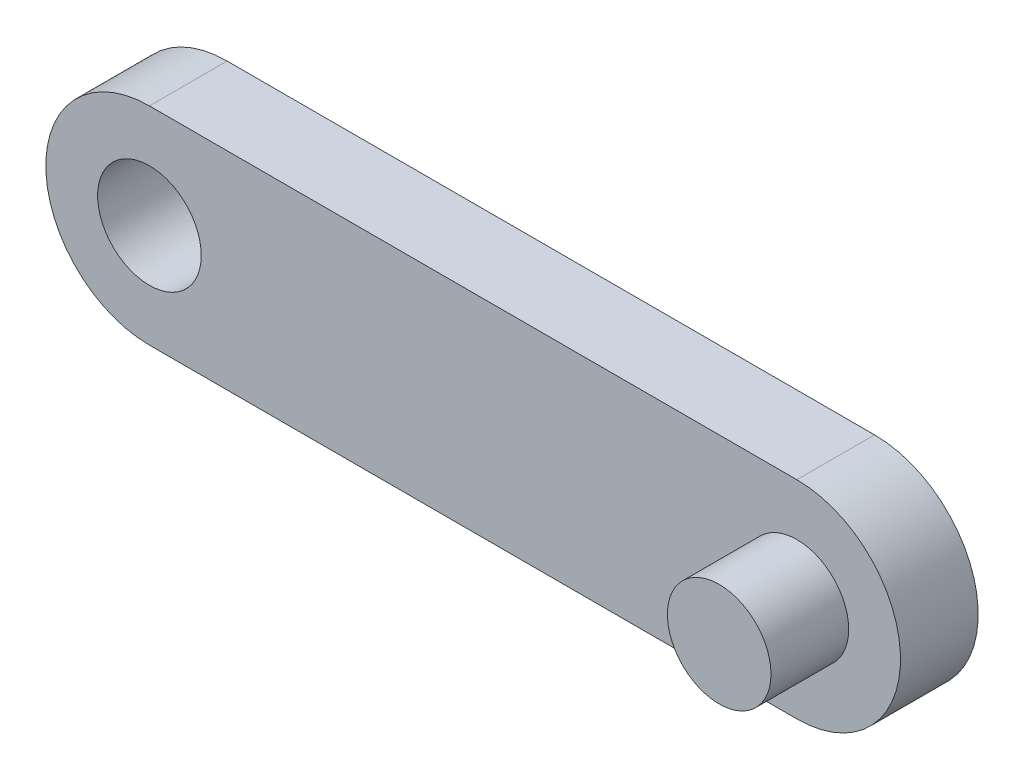
ISO-10303-21;
HEADER;
FILE_DESCRIPTION(('STEP AP214'),'2;1');
FILE_NAME('part.step','',(''),(''),'','','');
FILE_SCHEMA(('AUTOMOTIVE_DESIGN { 1 0 10303 214 1 1 1 1 }'));
ENDSEC;
DATA;
#1=APPLICATION_CONTEXT('core data for automotive mechanical design processes');
#2=APPLICATION_PROTOCOL_DEFINITION('international standard','automotive_design',2000,#1);
#3=PRODUCT_CONTEXT('',#1,'mechanical');
#4=PRODUCT('Part','Part','',(#3));
#5=PRODUCT_RELATED_PRODUCT_CATEGORY('part','',(#4));
#6=PRODUCT_DEFINITION_FORMATION('','',#4);
#7=PRODUCT_DEFINITION_CONTEXT('part definition',#1,'design');
#8=PRODUCT_DEFINITION('design','',#6,#7);
#9=PRODUCT_DEFINITION_SHAPE('','',#8);
#10=(LENGTH_UNIT() NAMED_UNIT(*) SI_UNIT(.MILLI.,.METRE.));
#11=(NAMED_UNIT(*) PLANE_ANGLE_UNIT() SI_UNIT($,.RADIAN.));
#12=(NAMED_UNIT(*) SI_UNIT($,.STERADIAN.) SOLID_ANGLE_UNIT());
#13=UNCERTAINTY_MEASURE_WITH_UNIT(LENGTH_MEASURE(1.E-05),#10,'distance_accuracy_value','');
#14=(GEOMETRIC_REPRESENTATION_CONTEXT(3) GLOBAL_UNCERTAINTY_ASSIGNED_CONTEXT((#13)) GLOBAL_UNIT_ASSIGNED_CONTEXT((#10,
#11,#12)) REPRESENTATION_CONTEXT('',''));
#15=CARTESIAN_POINT('',(0.,0.,0.));
#16=DIRECTION('',(0.,0.,1.));
#17=DIRECTION('',(1.,0.,0.));
#18=AXIS2_PLACEMENT_3D('',#15,#16,#17);
#19=CARTESIAN_POINT('',(0.,-40.,30.));
#20=DIRECTION('',(0.,0.,1.));
#21=DIRECTION('',(1.,0.,0.));
#22=AXIS2_PLACEMENT_3D('',#19,#20,#21);
#23=PLANE('',#22);
#24=CARTESIAN_POINT('',(250.,-40.,30.));
#25=DIRECTION('',(0.,0.,1.));
#26=DIRECTION('',(1.,0.,0.));
#27=AXIS2_PLACEMENT_3D('',#24,#25,#26);
#28=CIRCLE('',#27,20.);
#29=CARTESIAN_POINT('',(270.,-40.,30.));
#30=VERTEX_POINT('',#29);
#31=EDGE_CURVE('E160',#30,#30,#28,.T.);
#32=ORIENTED_EDGE('',*,*,#31,.F.);
#33=EDGE_LOOP('',(#32));
#34=FACE_BOUND('',#33,.T.);
#35=CARTESIAN_POINT('',(0.,-40.,30.));
#36=DIRECTION('',(0.,0.,1.));
#37=DIRECTION('',(1.,0.,0.));
#38=AXIS2_PLACEMENT_3D('',#35,#36,#37);
#39=CIRCLE('',#38,40.);
#40=CARTESIAN_POINT('',(0.,0.,30.));
#41=VERTEX_POINT('',#40);
#42=CARTESIAN_POINT('',(0.,-80.,30.));
#43=VERTEX_POINT('',#42);
#44=EDGE_CURVE('E108',#41,#43,#39,.T.);
#45=ORIENTED_EDGE('',*,*,#44,.T.);
#46=DIRECTION('',(1.,0.,0.));
#47=VECTOR('',#46,1.);
#48=CARTESIAN_POINT('',(0.,-80.,30.));
#49=LINE('',#48,#47);
#50=CARTESIAN_POINT('',(250.,-80.,30.));
#51=VERTEX_POINT('',#50);
#52=EDGE_CURVE('E103',#43,#51,#49,.T.);
#53=ORIENTED_EDGE('',*,*,#52,.T.);
#54=CARTESIAN_POINT('',(250.,-40.,30.));
#55=DIRECTION('',(0.,0.,1.));
#56=DIRECTION('',(1.,0.,0.));
#57=AXIS2_PLACEMENT_3D('',#54,#55,#56);
#58=CIRCLE('',#57,40.);
#59=CARTESIAN_POINT('',(250.,0.,30.));
#60=VERTEX_POINT('',#59);
#61=EDGE_CURVE('E106',#51,#60,#58,.T.);
#62=ORIENTED_EDGE('',*,*,#61,.T.);
#63=DIRECTION('',(-1.,0.,0.));
#64=VECTOR('',#63,1.);
#65=CARTESIAN_POINT('',(0.,0.,30.));
#66=LINE('',#65,#64);
#67=EDGE_CURVE('E73',#60,#41,#66,.T.);
#68=ORIENTED_EDGE('',*,*,#67,.T.);
#69=EDGE_LOOP('',(#45,#53,#62,#68));
#70=FACE_BOUND('',#69,.T.);
#71=CARTESIAN_POINT('',(0.,-40.,30.));
#72=DIRECTION('',(0.,0.,1.));
#73=DIRECTION('',(1.,0.,0.));
#74=AXIS2_PLACEMENT_3D('',#71,#72,#73);
#75=CIRCLE('',#74,20.);
#76=CARTESIAN_POINT('',(20.,-40.,30.));
#77=VERTEX_POINT('',#76);
#78=EDGE_CURVE('E130',#77,#77,#75,.T.);
#79=ORIENTED_EDGE('',*,*,#78,.F.);
#80=EDGE_LOOP('',(#79));
#81=FACE_BOUND('',#80,.T.);
#82=ADVANCED_FACE('F55',(#34,#70,#81),#23,.T.);
#83=CARTESIAN_POINT('',(0.,-40.,0.));
#84=DIRECTION('',(0.,0.,1.));
#85=DIRECTION('',(1.,0.,0.));
#86=AXIS2_PLACEMENT_3D('',#83,#84,#85);
#87=PLANE('',#86);
#88=CARTESIAN_POINT('',(0.,-40.,0.));
#89=DIRECTION('',(0.,0.,1.));
#90=DIRECTION('',(1.,0.,0.));
#91=AXIS2_PLACEMENT_3D('',#88,#89,#90);
#92=CIRCLE('',#91,40.);
#93=CARTESIAN_POINT('',(0.,0.,0.));
#94=VERTEX_POINT('',#93);
#95=CARTESIAN_POINT('',(0.,-80.,0.));
#96=VERTEX_POINT('',#95);
#97=EDGE_CURVE('E126',#94,#96,#92,.T.);
#98=ORIENTED_EDGE('',*,*,#97,.F.);
#99=DIRECTION('',(-1.,0.,0.));
#100=VECTOR('',#99,1.);
#101=CARTESIAN_POINT('',(0.,0.,0.));
#102=LINE('',#101,#100);
#103=CARTESIAN_POINT('',(250.,0.,0.));
#104=VERTEX_POINT('',#103);
#105=EDGE_CURVE('E96',#104,#94,#102,.T.);
#106=ORIENTED_EDGE('',*,*,#105,.F.);
#107=CARTESIAN_POINT('',(250.,-40.,0.));
#108=DIRECTION('',(0.,0.,1.));
#109=DIRECTION('',(1.,0.,0.));
#110=AXIS2_PLACEMENT_3D('',#107,#108,#109);
#111=CIRCLE('',#110,40.);
#112=CARTESIAN_POINT('',(250.,-80.,0.));
#113=VERTEX_POINT('',#112);
#114=EDGE_CURVE('E90',#113,#104,#111,.T.);
#115=ORIENTED_EDGE('',*,*,#114,.F.);
#116=DIRECTION('',(1.,0.,0.));
#117=VECTOR('',#116,1.);
#118=CARTESIAN_POINT('',(0.,-80.,0.));
#119=LINE('',#118,#117);
#120=EDGE_CURVE('E113',#96,#113,#119,.T.);
#121=ORIENTED_EDGE('',*,*,#120,.F.);
#122=EDGE_LOOP('',(#98,#106,#115,#121));
#123=FACE_BOUND('',#122,.T.);
#124=CARTESIAN_POINT('',(0.,-40.,0.));
#125=DIRECTION('',(0.,0.,1.));
#126=DIRECTION('',(1.,0.,0.));
#127=AXIS2_PLACEMENT_3D('',#124,#125,#126);
#128=CIRCLE('',#127,20.);
#129=CARTESIAN_POINT('',(20.,-40.,0.));
#130=VERTEX_POINT('',#129);
#131=EDGE_CURVE('E152',#130,#130,#128,.T.);
#132=ORIENTED_EDGE('',*,*,#131,.T.);
#133=EDGE_LOOP('',(#132));
#134=FACE_BOUND('',#133,.T.);
#135=ADVANCED_FACE('F145',(#123,#134),#87,.F.);
#136=CARTESIAN_POINT('',(0.,-40.,30.));
#137=DIRECTION('',(0.,0.,-1.));
#138=DIRECTION('',(-1.,0.,0.));
#139=AXIS2_PLACEMENT_3D('',#136,#137,#138);
#140=CYLINDRICAL_SURFACE('',#139,40.);
#141=ORIENTED_EDGE('',*,*,#97,.T.);
#142=DIRECTION('',(0.,0.,-1.));
#143=VECTOR('',#142,1.);
#144=CARTESIAN_POINT('',(0.,-80.,30.));
#145=LINE('',#144,#143);
#146=EDGE_CURVE('E13',#43,#96,#145,.T.);
#147=ORIENTED_EDGE('',*,*,#146,.F.);
#148=ORIENTED_EDGE('',*,*,#44,.F.);
#149=DIRECTION('',(0.,0.,-1.));
#150=VECTOR('',#149,1.);
#151=CARTESIAN_POINT('',(0.,0.,30.));
#152=LINE('',#151,#150);
#153=EDGE_CURVE('E122',#41,#94,#152,.T.);
#154=ORIENTED_EDGE('',*,*,#153,.T.);
#155=EDGE_LOOP('',(#141,#147,#148,#154));
#156=FACE_BOUND('',#155,.T.);
#157=ADVANCED_FACE('F57',(#156),#140,.T.);
#158=CARTESIAN_POINT('',(0.,-80.,30.));
#159=DIRECTION('',(0.,1.,0.));
#160=DIRECTION('',(0.,0.,1.));
#161=AXIS2_PLACEMENT_3D('',#158,#159,#160);
#162=PLANE('',#161);
#163=ORIENTED_EDGE('',*,*,#120,.T.);
#164=DIRECTION('',(0.,0.,-1.));
#165=VECTOR('',#164,1.);
#166=CARTESIAN_POINT('',(250.,-80.,30.));
#167=LINE('',#166,#165);
#168=EDGE_CURVE('E65',#51,#113,#167,.T.);
#169=ORIENTED_EDGE('',*,*,#168,.F.);
#170=ORIENTED_EDGE('',*,*,#52,.F.);
#171=ORIENTED_EDGE('',*,*,#146,.T.);
#172=EDGE_LOOP('',(#163,#169,#170,#171));
#173=FACE_BOUND('',#172,.T.);
#174=ADVANCED_FACE('F112',(#173),#162,.F.);
#175=CARTESIAN_POINT('',(250.,-40.,30.));
#176=DIRECTION('',(0.,0.,-1.));
#177=DIRECTION('',(-1.,0.,0.));
#178=AXIS2_PLACEMENT_3D('',#175,#176,#177);
#179=CYLINDRICAL_SURFACE('',#178,40.);
#180=ORIENTED_EDGE('',*,*,#114,.T.);
#181=DIRECTION('',(0.,0.,-1.));
#182=VECTOR('',#181,1.);
#183=CARTESIAN_POINT('',(250.,0.,30.));
#184=LINE('',#183,#182);
#185=EDGE_CURVE('E115',#60,#104,#184,.T.);
#186=ORIENTED_EDGE('',*,*,#185,.F.);
#187=ORIENTED_EDGE('',*,*,#61,.F.);
#188=ORIENTED_EDGE('',*,*,#168,.T.);
#189=EDGE_LOOP('',(#180,#186,#187,#188));
#190=FACE_BOUND('',#189,.T.);
#191=ADVANCED_FACE('F116',(#190),#179,.T.);
#192=CARTESIAN_POINT('',(0.,0.,30.));
#193=DIRECTION('',(0.,-1.,0.));
#194=DIRECTION('',(0.,0.,-1.));
#195=AXIS2_PLACEMENT_3D('',#192,#193,#194);
#196=PLANE('',#195);
#197=ORIENTED_EDGE('',*,*,#105,.T.);
#198=ORIENTED_EDGE('',*,*,#153,.F.);
#199=ORIENTED_EDGE('',*,*,#67,.F.);
#200=ORIENTED_EDGE('',*,*,#185,.T.);
#201=EDGE_LOOP('',(#197,#198,#199,#200));
#202=FACE_BOUND('',#201,.T.);
#203=ADVANCED_FACE('F142',(#202),#196,.F.);
#204=CARTESIAN_POINT('',(0.,-40.,30.));
#205=DIRECTION('',(0.,0.,-1.));
#206=DIRECTION('',(-1.,0.,0.));
#207=AXIS2_PLACEMENT_3D('',#204,#205,#206);
#208=CYLINDRICAL_SURFACE('',#207,20.);
#209=ORIENTED_EDGE('',*,*,#78,.T.);
#210=EDGE_LOOP('',(#209));
#211=FACE_BOUND('',#210,.T.);
#212=ORIENTED_EDGE('',*,*,#131,.F.);
#213=EDGE_LOOP('',(#212));
#214=FACE_BOUND('',#213,.T.);
#215=ADVANCED_FACE('F175',(#211,#214),#208,.F.);
#216=CARTESIAN_POINT('',(250.,-40.,60.));
#217=DIRECTION('',(0.,0.,-1.));
#218=DIRECTION('',(-1.,0.,0.));
#219=AXIS2_PLACEMENT_3D('',#216,#217,#218);
#220=CYLINDRICAL_SURFACE('',#219,20.);
#221=CARTESIAN_POINT('',(250.,-40.,60.));
#222=DIRECTION('',(0.,0.,1.));
#223=DIRECTION('',(1.,0.,0.));
#224=AXIS2_PLACEMENT_3D('',#221,#222,#223);
#225=CIRCLE('',#224,20.);
#226=CARTESIAN_POINT('',(270.,-40.,60.));
#227=VERTEX_POINT('',#226);
#228=EDGE_CURVE('E156',#227,#227,#225,.T.);
#229=ORIENTED_EDGE('',*,*,#228,.F.);
#230=EDGE_LOOP('',(#229));
#231=FACE_BOUND('',#230,.T.);
#232=ORIENTED_EDGE('',*,*,#31,.T.);
#233=EDGE_LOOP('',(#232));
#234=FACE_BOUND('',#233,.T.);
#235=ADVANCED_FACE('F172',(#231,#234),#220,.T.);
#236=CARTESIAN_POINT('',(250.,-40.,60.));
#237=DIRECTION('',(0.,0.,1.));
#238=DIRECTION('',(1.,0.,0.));
#239=AXIS2_PLACEMENT_3D('',#236,#237,#238);
#240=PLANE('',#239);
#241=ORIENTED_EDGE('',*,*,#228,.T.);
#242=EDGE_LOOP('',(#241));
#243=FACE_BOUND('',#242,.T.);
#244=ADVANCED_FACE('F170',(#243),#240,.T.);
#245=CLOSED_SHELL('',(#82,#135,#157,#174,#191,#203,#215,#235,#244));
#246=MANIFOLD_SOLID_BREP('B2',#245);
#247=ADVANCED_BREP_SHAPE_REPRESENTATION('',(#18,#246),#14);
#248=SHAPE_DEFINITION_REPRESENTATION(#9,#247);
ENDSEC;
END-ISO-10303-21;
